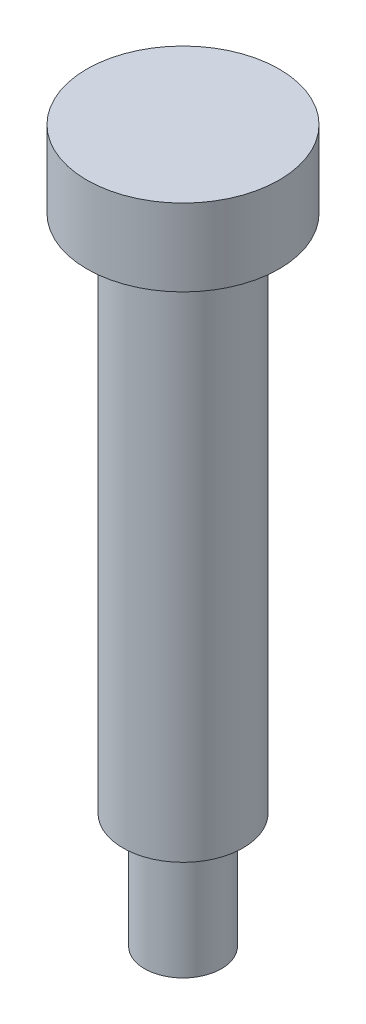
ISO-10303-21;
HEADER;
FILE_DESCRIPTION(('STEP AP214'),'2;1');
FILE_NAME('part.step','',(''),(''),'','','');
FILE_SCHEMA(('AUTOMOTIVE_DESIGN { 1 0 10303 214 1 1 1 1 }'));
ENDSEC;
DATA;
#1=APPLICATION_CONTEXT('core data for automotive mechanical design processes');
#2=APPLICATION_PROTOCOL_DEFINITION('international standard','automotive_design',2000,#1);
#3=PRODUCT_CONTEXT('',#1,'mechanical');
#4=PRODUCT('Part','Part','',(#3));
#5=PRODUCT_RELATED_PRODUCT_CATEGORY('part','',(#4));
#6=PRODUCT_DEFINITION_FORMATION('','',#4);
#7=PRODUCT_DEFINITION_CONTEXT('part definition',#1,'design');
#8=PRODUCT_DEFINITION('design','',#6,#7);
#9=PRODUCT_DEFINITION_SHAPE('','',#8);
#10=(LENGTH_UNIT() NAMED_UNIT(*) SI_UNIT(.MILLI.,.METRE.));
#11=(NAMED_UNIT(*) PLANE_ANGLE_UNIT() SI_UNIT($,.RADIAN.));
#12=(NAMED_UNIT(*) SI_UNIT($,.STERADIAN.) SOLID_ANGLE_UNIT());
#13=UNCERTAINTY_MEASURE_WITH_UNIT(LENGTH_MEASURE(1.E-05),#10,'distance_accuracy_value','');
#14=(GEOMETRIC_REPRESENTATION_CONTEXT(3) GLOBAL_UNCERTAINTY_ASSIGNED_CONTEXT((#13)) GLOBAL_UNIT_ASSIGNED_CONTEXT((#10,
#11,#12)) REPRESENTATION_CONTEXT('',''));
#15=CARTESIAN_POINT('',(0.,0.,0.));
#16=DIRECTION('',(0.,0.,1.));
#17=DIRECTION('',(1.,0.,0.));
#18=AXIS2_PLACEMENT_3D('',#15,#16,#17);
#19=CARTESIAN_POINT('',(0.,-4.,0.));
#20=DIRECTION('',(0.,1.,0.));
#21=DIRECTION('',(0.,0.,1.));
#22=AXIS2_PLACEMENT_3D('',#19,#20,#21);
#23=CYLINDRICAL_SURFACE('',#22,5.);
#24=CARTESIAN_POINT('',(0.,-4.,0.));
#25=DIRECTION('',(0.,1.,0.));
#26=DIRECTION('',(0.,0.,1.));
#27=AXIS2_PLACEMENT_3D('',#24,#25,#26);
#28=CIRCLE('',#27,5.);
#29=CARTESIAN_POINT('',(0.,-4.,5.));
#30=VERTEX_POINT('',#29);
#31=EDGE_CURVE('E57',#30,#30,#28,.T.);
#32=ORIENTED_EDGE('',*,*,#31,.T.);
#33=EDGE_LOOP('',(#32));
#34=FACE_BOUND('',#33,.T.);
#35=CARTESIAN_POINT('',(0.,0.,0.));
#36=DIRECTION('',(0.,1.,0.));
#37=DIRECTION('',(0.,0.,1.));
#38=AXIS2_PLACEMENT_3D('',#35,#36,#37);
#39=CIRCLE('',#38,5.);
#40=CARTESIAN_POINT('',(0.,0.,5.));
#41=VERTEX_POINT('',#40);
#42=EDGE_CURVE('E46',#41,#41,#39,.T.);
#43=ORIENTED_EDGE('',*,*,#42,.F.);
#44=EDGE_LOOP('',(#43));
#45=FACE_BOUND('',#44,.T.);
#46=ADVANCED_FACE('F43',(#34,#45),#23,.T.);
#47=CARTESIAN_POINT('',(0.,-4.,0.));
#48=DIRECTION('',(0.,1.,0.));
#49=DIRECTION('',(0.,0.,1.));
#50=AXIS2_PLACEMENT_3D('',#47,#48,#49);
#51=PLANE('',#50);
#52=CARTESIAN_POINT('',(0.,-4.,0.));
#53=DIRECTION('',(0.,-1.,0.));
#54=DIRECTION('',(0.,0.,-1.));
#55=AXIS2_PLACEMENT_3D('',#52,#53,#54);
#56=CIRCLE('',#55,3.125);
#57=CARTESIAN_POINT('',(0.,-4.,-3.125));
#58=VERTEX_POINT('',#57);
#59=EDGE_CURVE('E51',#58,#58,#56,.T.);
#60=ORIENTED_EDGE('',*,*,#59,.F.);
#61=EDGE_LOOP('',(#60));
#62=FACE_BOUND('',#61,.T.);
#63=ORIENTED_EDGE('',*,*,#31,.F.);
#64=EDGE_LOOP('',(#63));
#65=FACE_BOUND('',#64,.T.);
#66=ADVANCED_FACE('F76',(#62,#65),#51,.F.);
#67=CARTESIAN_POINT('',(0.,0.,0.));
#68=DIRECTION('',(0.,1.,0.));
#69=DIRECTION('',(0.,0.,1.));
#70=AXIS2_PLACEMENT_3D('',#67,#68,#69);
#71=PLANE('',#70);
#72=ORIENTED_EDGE('',*,*,#42,.T.);
#73=EDGE_LOOP('',(#72));
#74=FACE_BOUND('',#73,.T.);
#75=ADVANCED_FACE('F73',(#74),#71,.T.);
#76=CARTESIAN_POINT('',(0.,-31.,0.));
#77=DIRECTION('',(0.,1.,0.));
#78=DIRECTION('',(0.,0.,1.));
#79=AXIS2_PLACEMENT_3D('',#76,#77,#78);
#80=CYLINDRICAL_SURFACE('',#79,3.125);
#81=CARTESIAN_POINT('',(0.,-31.,0.));
#82=DIRECTION('',(0.,-1.,0.));
#83=DIRECTION('',(0.,0.,-1.));
#84=AXIS2_PLACEMENT_3D('',#81,#82,#83);
#85=CIRCLE('',#84,3.125);
#86=CARTESIAN_POINT('',(0.,-31.,-3.125));
#87=VERTEX_POINT('',#86);
#88=EDGE_CURVE('E62',#87,#87,#85,.T.);
#89=ORIENTED_EDGE('',*,*,#88,.F.);
#90=EDGE_LOOP('',(#89));
#91=FACE_BOUND('',#90,.T.);
#92=ORIENTED_EDGE('',*,*,#59,.T.);
#93=EDGE_LOOP('',(#92));
#94=FACE_BOUND('',#93,.T.);
#95=ADVANCED_FACE('F86',(#91,#94),#80,.T.);
#96=CARTESIAN_POINT('',(0.,-31.,0.));
#97=DIRECTION('',(0.,-1.,0.));
#98=DIRECTION('',(0.,0.,-1.));
#99=AXIS2_PLACEMENT_3D('',#96,#97,#98);
#100=PLANE('',#99);
#101=CARTESIAN_POINT('',(0.,-31.,0.));
#102=DIRECTION('',(0.,-1.,0.));
#103=DIRECTION('',(0.,0.,-1.));
#104=AXIS2_PLACEMENT_3D('',#101,#102,#103);
#105=CIRCLE('',#104,2.);
#106=CARTESIAN_POINT('',(0.,-31.,-2.));
#107=VERTEX_POINT('',#106);
#108=EDGE_CURVE('E10',#107,#107,#105,.T.);
#109=ORIENTED_EDGE('',*,*,#108,.F.);
#110=EDGE_LOOP('',(#109));
#111=FACE_BOUND('',#110,.T.);
#112=ORIENTED_EDGE('',*,*,#88,.T.);
#113=EDGE_LOOP('',(#112));
#114=FACE_BOUND('',#113,.T.);
#115=ADVANCED_FACE('F91',(#111,#114),#100,.T.);
#116=CARTESIAN_POINT('',(0.,-37.,0.));
#117=DIRECTION('',(0.,1.,0.));
#118=DIRECTION('',(0.,0.,1.));
#119=AXIS2_PLACEMENT_3D('',#116,#117,#118);
#120=CYLINDRICAL_SURFACE('',#119,2.);
#121=CARTESIAN_POINT('',(0.,-37.,0.));
#122=DIRECTION('',(0.,-1.,0.));
#123=DIRECTION('',(0.,0.,-1.));
#124=AXIS2_PLACEMENT_3D('',#121,#122,#123);
#125=CIRCLE('',#124,2.);
#126=CARTESIAN_POINT('',(0.,-37.,-2.));
#127=VERTEX_POINT('',#126);
#128=EDGE_CURVE('E61',#127,#127,#125,.T.);
#129=ORIENTED_EDGE('',*,*,#128,.F.);
#130=EDGE_LOOP('',(#129));
#131=FACE_BOUND('',#130,.T.);
#132=ORIENTED_EDGE('',*,*,#108,.T.);
#133=EDGE_LOOP('',(#132));
#134=FACE_BOUND('',#133,.T.);
#135=ADVANCED_FACE('F95',(#131,#134),#120,.T.);
#136=CARTESIAN_POINT('',(0.,-37.,0.));
#137=DIRECTION('',(0.,-1.,0.));
#138=DIRECTION('',(0.,0.,-1.));
#139=AXIS2_PLACEMENT_3D('',#136,#137,#138);
#140=PLANE('',#139);
#141=ORIENTED_EDGE('',*,*,#128,.T.);
#142=EDGE_LOOP('',(#141));
#143=FACE_BOUND('',#142,.T.);
#144=ADVANCED_FACE('F99',(#143),#140,.T.);
#145=CLOSED_SHELL('',(#46,#66,#75,#95,#115,#135,#144));
#146=MANIFOLD_SOLID_BREP('B2',#145);
#147=ADVANCED_BREP_SHAPE_REPRESENTATION('',(#18,#146),#14);
#148=SHAPE_DEFINITION_REPRESENTATION(#9,#147);
ENDSEC;
END-ISO-10303-21;
